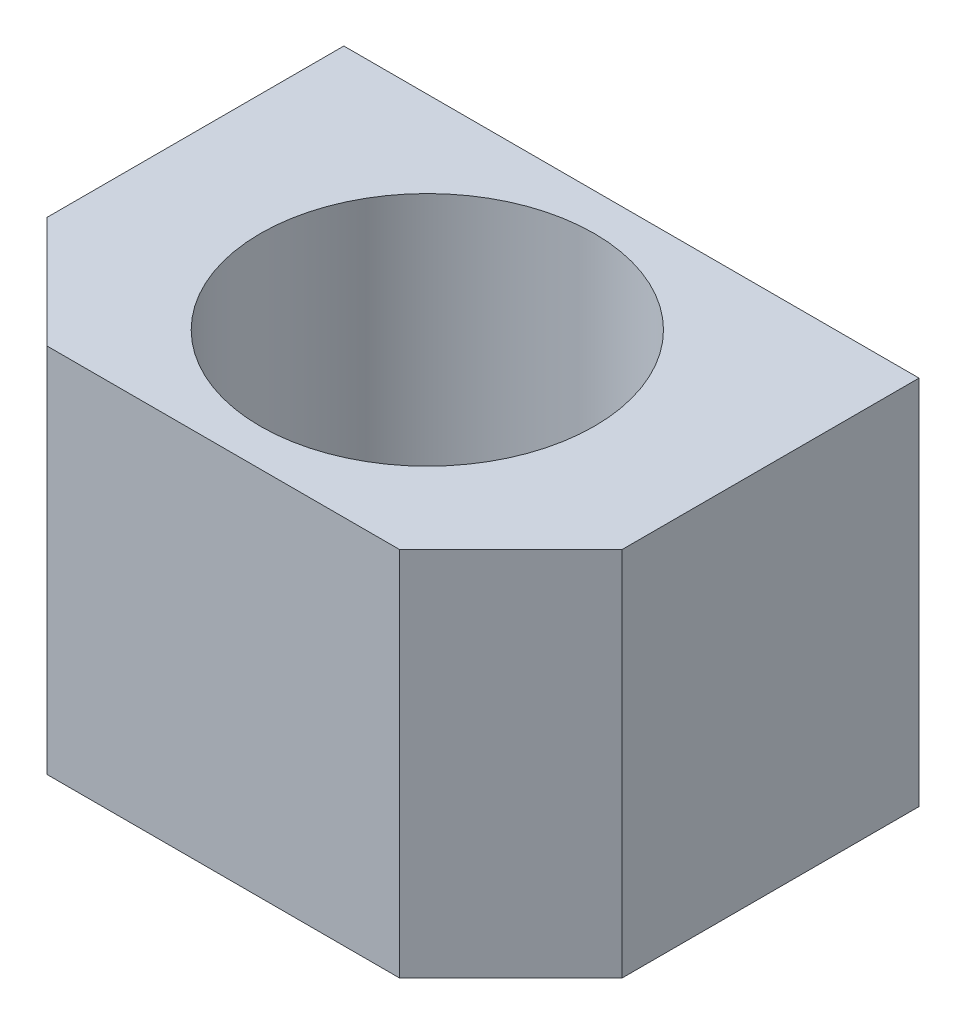
ISO-10303-21;
HEADER;
FILE_DESCRIPTION(('STEP AP214'),'2;1');
FILE_NAME('part.step','',(''),(''),'','','');
FILE_SCHEMA(('AUTOMOTIVE_DESIGN { 1 0 10303 214 1 1 1 1 }'));
ENDSEC;
DATA;
#1=APPLICATION_CONTEXT('core data for automotive mechanical design processes');
#2=APPLICATION_PROTOCOL_DEFINITION('international standard','automotive_design',2000,#1);
#3=PRODUCT_CONTEXT('',#1,'mechanical');
#4=PRODUCT('Part','Part','',(#3));
#5=PRODUCT_RELATED_PRODUCT_CATEGORY('part','',(#4));
#6=PRODUCT_DEFINITION_FORMATION('','',#4);
#7=PRODUCT_DEFINITION_CONTEXT('part definition',#1,'design');
#8=PRODUCT_DEFINITION('design','',#6,#7);
#9=PRODUCT_DEFINITION_SHAPE('','',#8);
#10=(LENGTH_UNIT() NAMED_UNIT(*) SI_UNIT(.MILLI.,.METRE.));
#11=(NAMED_UNIT(*) PLANE_ANGLE_UNIT() SI_UNIT($,.RADIAN.));
#12=(NAMED_UNIT(*) SI_UNIT($,.STERADIAN.) SOLID_ANGLE_UNIT());
#13=UNCERTAINTY_MEASURE_WITH_UNIT(LENGTH_MEASURE(1.E-05),#10,'distance_accuracy_value','');
#14=(GEOMETRIC_REPRESENTATION_CONTEXT(3) GLOBAL_UNCERTAINTY_ASSIGNED_CONTEXT((#13)) GLOBAL_UNIT_ASSIGNED_CONTEXT((#10,
#11,#12)) REPRESENTATION_CONTEXT('',''));
#15=CARTESIAN_POINT('',(0.,0.,0.));
#16=DIRECTION('',(0.,0.,1.));
#17=DIRECTION('',(1.,0.,0.));
#18=AXIS2_PLACEMENT_3D('',#15,#16,#17);
#19=CARTESIAN_POINT('',(0.,-20.,22.));
#20=DIRECTION('',(0.,1.,0.));
#21=DIRECTION('',(0.,0.,-1.));
#22=AXIS2_PLACEMENT_3D('',#19,#20,#21);
#23=PLANE('',#22);
#24=CARTESIAN_POINT('',(0.,-20.,22.));
#25=DIRECTION('',(0.,-1.,0.));
#26=DIRECTION('',(1.,0.,0.));
#27=AXIS2_PLACEMENT_3D('',#24,#25,#26);
#28=CIRCLE('',#27,18.);
#29=CARTESIAN_POINT('',(-18.,-20.,22.));
#30=VERTEX_POINT('',#29);
#31=EDGE_CURVE('E232',#30,#30,#28,.T.);
#32=ORIENTED_EDGE('',*,*,#31,.F.);
#33=EDGE_LOOP('',(#32));
#34=FACE_BOUND('',#33,.T.);
#35=CARTESIAN_POINT('',(-16.6170093578839,-20.,5.38299064211615));
#36=DIRECTION('',(0.,1.,0.));
#37=DIRECTION('',(0.,0.,-1.));
#38=AXIS2_PLACEMENT_3D('',#35,#36,#37);
#39=CIRCLE('',#38,2.5175);
#40=CARTESIAN_POINT('',(-16.6170093578839,-20.,7.90049064211614));
#41=VERTEX_POINT('',#40);
#42=EDGE_CURVE('E218',#41,#41,#39,.T.);
#43=ORIENTED_EDGE('',*,*,#42,.T.);
#44=EDGE_LOOP('',(#43));
#45=FACE_BOUND('',#44,.T.);
#46=CARTESIAN_POINT('',(-16.6170093578839,-20.,38.6170093578839));
#47=DIRECTION('',(0.,1.,0.));
#48=DIRECTION('',(0.,0.,-1.));
#49=AXIS2_PLACEMENT_3D('',#46,#47,#48);
#50=CIRCLE('',#49,2.5175);
#51=CARTESIAN_POINT('',(-16.6170093578839,-20.,41.1345093578839));
#52=VERTEX_POINT('',#51);
#53=EDGE_CURVE('E200',#52,#52,#50,.T.);
#54=ORIENTED_EDGE('',*,*,#53,.T.);
#55=EDGE_LOOP('',(#54));
#56=FACE_BOUND('',#55,.T.);
#57=CARTESIAN_POINT('',(-23.5,-20.,22.));
#58=DIRECTION('',(0.,1.,0.));
#59=DIRECTION('',(0.,0.,-1.));
#60=AXIS2_PLACEMENT_3D('',#57,#58,#59);
#61=CIRCLE('',#60,2.5175);
#62=CARTESIAN_POINT('',(-23.5,-20.,24.5175));
#63=VERTEX_POINT('',#62);
#64=EDGE_CURVE('E389',#63,#63,#61,.T.);
#65=ORIENTED_EDGE('',*,*,#64,.T.);
#66=EDGE_LOOP('',(#65));
#67=FACE_BOUND('',#66,.T.);
#68=CARTESIAN_POINT('',(16.6170093578839,-20.,5.38299064211615));
#69=DIRECTION('',(0.,1.,0.));
#70=DIRECTION('',(0.,0.,-1.));
#71=AXIS2_PLACEMENT_3D('',#68,#69,#70);
#72=CIRCLE('',#71,2.5175);
#73=CARTESIAN_POINT('',(16.6170093578839,-20.,7.90049064211614));
#74=VERTEX_POINT('',#73);
#75=EDGE_CURVE('E348',#74,#74,#72,.T.);
#76=ORIENTED_EDGE('',*,*,#75,.T.);
#77=EDGE_LOOP('',(#76));
#78=FACE_BOUND('',#77,.T.);
#79=CARTESIAN_POINT('',(16.6170093578839,-20.,38.6170093578839));
#80=DIRECTION('',(0.,1.,0.));
#81=DIRECTION('',(0.,0.,-1.));
#82=AXIS2_PLACEMENT_3D('',#79,#80,#81);
#83=CIRCLE('',#82,2.5175);
#84=CARTESIAN_POINT('',(16.6170093578839,-20.,41.1345093578839));
#85=VERTEX_POINT('',#84);
#86=EDGE_CURVE('E375',#85,#85,#83,.T.);
#87=ORIENTED_EDGE('',*,*,#86,.T.);
#88=EDGE_LOOP('',(#87));
#89=FACE_BOUND('',#88,.T.);
#90=CARTESIAN_POINT('',(23.5,-20.,22.));
#91=DIRECTION('',(0.,1.,0.));
#92=DIRECTION('',(0.,0.,-1.));
#93=AXIS2_PLACEMENT_3D('',#90,#91,#92);
#94=CIRCLE('',#93,2.5175);
#95=CARTESIAN_POINT('',(23.5,-20.,24.5175));
#96=VERTEX_POINT('',#95);
#97=EDGE_CURVE('E318',#96,#96,#94,.T.);
#98=ORIENTED_EDGE('',*,*,#97,.T.);
#99=EDGE_LOOP('',(#98));
#100=FACE_BOUND('',#99,.T.);
#101=DIRECTION('',(0.707106781186547,0.,-0.707106781186548));
#102=VECTOR('',#101,1.);
#103=CARTESIAN_POINT('',(19.,-20.,44.));
#104=LINE('',#103,#102);
#105=CARTESIAN_POINT('',(19.,-20.,44.));
#106=VERTEX_POINT('',#105);
#107=CARTESIAN_POINT('',(31.,-20.,32.));
#108=VERTEX_POINT('',#107);
#109=EDGE_CURVE('E25',#106,#108,#104,.T.);
#110=ORIENTED_EDGE('',*,*,#109,.F.);
#111=DIRECTION('',(1.,0.,0.));
#112=VECTOR('',#111,1.);
#113=CARTESIAN_POINT('',(-31.,-20.,44.));
#114=LINE('',#113,#112);
#115=CARTESIAN_POINT('',(-19.,-20.,44.));
#116=VERTEX_POINT('',#115);
#117=EDGE_CURVE('E236',#116,#106,#114,.T.);
#118=ORIENTED_EDGE('',*,*,#117,.F.);
#119=DIRECTION('',(0.707106781186547,0.,0.707106781186548));
#120=VECTOR('',#119,1.);
#121=CARTESIAN_POINT('',(-31.,-20.,32.));
#122=LINE('',#121,#120);
#123=CARTESIAN_POINT('',(-31.,-20.,32.));
#124=VERTEX_POINT('',#123);
#125=EDGE_CURVE('E250',#124,#116,#122,.T.);
#126=ORIENTED_EDGE('',*,*,#125,.F.);
#127=DIRECTION('',(0.,0.,1.));
#128=VECTOR('',#127,1.);
#129=CARTESIAN_POINT('',(-31.,-20.,0.));
#130=LINE('',#129,#128);
#131=CARTESIAN_POINT('',(-31.,-20.,0.));
#132=VERTEX_POINT('',#131);
#133=EDGE_CURVE('E260',#132,#124,#130,.T.);
#134=ORIENTED_EDGE('',*,*,#133,.F.);
#135=DIRECTION('',(-1.,0.,0.));
#136=VECTOR('',#135,1.);
#137=CARTESIAN_POINT('',(31.,-20.,0.));
#138=LINE('',#137,#136);
#139=CARTESIAN_POINT('',(31.,-20.,0.));
#140=VERTEX_POINT('',#139);
#141=EDGE_CURVE('E270',#140,#132,#138,.T.);
#142=ORIENTED_EDGE('',*,*,#141,.F.);
#143=DIRECTION('',(0.,0.,-1.));
#144=VECTOR('',#143,1.);
#145=CARTESIAN_POINT('',(31.,-20.,44.));
#146=LINE('',#145,#144);
#147=EDGE_CURVE('E280',#108,#140,#146,.T.);
#148=ORIENTED_EDGE('',*,*,#147,.F.);
#149=EDGE_LOOP('',(#110,#118,#126,#134,#142,#148));
#150=FACE_BOUND('',#149,.T.);
#151=ADVANCED_FACE('F17',(#34,#45,#56,#67,#78,#89,#100,#150),#23,.F.);
#152=CARTESIAN_POINT('',(0.,20.,22.));
#153=DIRECTION('',(0.,1.,0.));
#154=DIRECTION('',(0.,0.,-1.));
#155=AXIS2_PLACEMENT_3D('',#152,#153,#154);
#156=PLANE('',#155);
#157=CARTESIAN_POINT('',(0.,20.,22.));
#158=DIRECTION('',(0.,-1.,0.));
#159=DIRECTION('',(1.,0.,0.));
#160=AXIS2_PLACEMENT_3D('',#157,#158,#159);
#161=CIRCLE('',#160,18.);
#162=CARTESIAN_POINT('',(-18.,20.,22.));
#163=VERTEX_POINT('',#162);
#164=EDGE_CURVE('E226',#163,#163,#161,.T.);
#165=ORIENTED_EDGE('',*,*,#164,.T.);
#166=EDGE_LOOP('',(#165));
#167=FACE_BOUND('',#166,.T.);
#168=DIRECTION('',(0.707106781186547,0.,-0.707106781186548));
#169=VECTOR('',#168,1.);
#170=CARTESIAN_POINT('',(19.,20.,44.));
#171=LINE('',#170,#169);
#172=CARTESIAN_POINT('',(19.,20.,44.));
#173=VERTEX_POINT('',#172);
#174=CARTESIAN_POINT('',(31.,20.,32.));
#175=VERTEX_POINT('',#174);
#176=EDGE_CURVE('E11',#173,#175,#171,.T.);
#177=ORIENTED_EDGE('',*,*,#176,.T.);
#178=DIRECTION('',(0.,0.,-1.));
#179=VECTOR('',#178,1.);
#180=CARTESIAN_POINT('',(31.,20.,44.));
#181=LINE('',#180,#179);
#182=CARTESIAN_POINT('',(31.,20.,0.));
#183=VERTEX_POINT('',#182);
#184=EDGE_CURVE('E278',#175,#183,#181,.T.);
#185=ORIENTED_EDGE('',*,*,#184,.T.);
#186=DIRECTION('',(-1.,0.,0.));
#187=VECTOR('',#186,1.);
#188=CARTESIAN_POINT('',(31.,20.,0.));
#189=LINE('',#188,#187);
#190=CARTESIAN_POINT('',(-31.,20.,0.));
#191=VERTEX_POINT('',#190);
#192=EDGE_CURVE('E269',#183,#191,#189,.T.);
#193=ORIENTED_EDGE('',*,*,#192,.T.);
#194=DIRECTION('',(0.,0.,1.));
#195=VECTOR('',#194,1.);
#196=CARTESIAN_POINT('',(-31.,20.,0.));
#197=LINE('',#196,#195);
#198=CARTESIAN_POINT('',(-31.,20.,32.));
#199=VERTEX_POINT('',#198);
#200=EDGE_CURVE('E257',#191,#199,#197,.T.);
#201=ORIENTED_EDGE('',*,*,#200,.T.);
#202=DIRECTION('',(0.707106781186547,0.,0.707106781186548));
#203=VECTOR('',#202,1.);
#204=CARTESIAN_POINT('',(-31.,20.,32.));
#205=LINE('',#204,#203);
#206=CARTESIAN_POINT('',(-19.,20.,44.));
#207=VERTEX_POINT('',#206);
#208=EDGE_CURVE('E249',#199,#207,#205,.T.);
#209=ORIENTED_EDGE('',*,*,#208,.T.);
#210=DIRECTION('',(1.,0.,0.));
#211=VECTOR('',#210,1.);
#212=CARTESIAN_POINT('',(-31.,20.,44.));
#213=LINE('',#212,#211);
#214=EDGE_CURVE('E238',#207,#173,#213,.T.);
#215=ORIENTED_EDGE('',*,*,#214,.T.);
#216=EDGE_LOOP('',(#177,#185,#193,#201,#209,#215));
#217=FACE_BOUND('',#216,.T.);
#218=ADVANCED_FACE('F315',(#167,#217),#156,.T.);
#219=CARTESIAN_POINT('',(19.,-20.,44.));
#220=DIRECTION('',(0.707106781186548,0.,0.707106781186547));
#221=DIRECTION('',(0.,-1.,0.));
#222=AXIS2_PLACEMENT_3D('',#219,#220,#221);
#223=PLANE('',#222);
#224=ORIENTED_EDGE('',*,*,#109,.T.);
#225=DIRECTION('',(0.,1.,0.));
#226=VECTOR('',#225,1.);
#227=CARTESIAN_POINT('',(31.,-20.,32.));
#228=LINE('',#227,#226);
#229=EDGE_CURVE('E281',#108,#175,#228,.T.);
#230=ORIENTED_EDGE('',*,*,#229,.T.);
#231=ORIENTED_EDGE('',*,*,#176,.F.);
#232=DIRECTION('',(0.,1.,0.));
#233=VECTOR('',#232,1.);
#234=CARTESIAN_POINT('',(19.,-20.,44.));
#235=LINE('',#234,#233);
#236=EDGE_CURVE('E242',#106,#173,#235,.T.);
#237=ORIENTED_EDGE('',*,*,#236,.F.);
#238=EDGE_LOOP('',(#224,#230,#231,#237));
#239=FACE_BOUND('',#238,.T.);
#240=ADVANCED_FACE('F287',(#239),#223,.T.);
#241=CARTESIAN_POINT('',(31.,-20.,32.));
#242=DIRECTION('',(1.,0.,0.));
#243=DIRECTION('',(0.,0.,1.));
#244=AXIS2_PLACEMENT_3D('',#241,#242,#243);
#245=PLANE('',#244);
#246=ORIENTED_EDGE('',*,*,#147,.T.);
#247=DIRECTION('',(0.,1.,0.));
#248=VECTOR('',#247,1.);
#249=CARTESIAN_POINT('',(31.,-20.,0.));
#250=LINE('',#249,#248);
#251=EDGE_CURVE('E272',#140,#183,#250,.T.);
#252=ORIENTED_EDGE('',*,*,#251,.T.);
#253=ORIENTED_EDGE('',*,*,#184,.F.);
#254=ORIENTED_EDGE('',*,*,#229,.F.);
#255=EDGE_LOOP('',(#246,#252,#253,#254));
#256=FACE_BOUND('',#255,.T.);
#257=ADVANCED_FACE('F300',(#256),#245,.T.);
#258=CARTESIAN_POINT('',(31.,-20.,0.));
#259=DIRECTION('',(0.,0.,-1.));
#260=DIRECTION('',(0.,-1.,0.));
#261=AXIS2_PLACEMENT_3D('',#258,#259,#260);
#262=PLANE('',#261);
#263=CARTESIAN_POINT('',(24.,-12.,0.));
#264=DIRECTION('',(0.,0.,1.));
#265=DIRECTION('',(-1.,0.,0.));
#266=AXIS2_PLACEMENT_3D('',#263,#264,#265);
#267=CIRCLE('',#266,2.5175);
#268=CARTESIAN_POINT('',(26.5175,-12.,0.));
#269=VERTEX_POINT('',#268);
#270=EDGE_CURVE('E338',#269,#269,#267,.T.);
#271=ORIENTED_EDGE('',*,*,#270,.T.);
#272=EDGE_LOOP('',(#271));
#273=FACE_BOUND('',#272,.T.);
#274=CARTESIAN_POINT('',(-24.,12.,0.));
#275=DIRECTION('',(0.,0.,1.));
#276=DIRECTION('',(-1.,0.,0.));
#277=AXIS2_PLACEMENT_3D('',#274,#275,#276);
#278=CIRCLE('',#277,2.5175);
#279=CARTESIAN_POINT('',(-21.4825,12.,0.));
#280=VERTEX_POINT('',#279);
#281=EDGE_CURVE('E343',#280,#280,#278,.T.);
#282=ORIENTED_EDGE('',*,*,#281,.T.);
#283=EDGE_LOOP('',(#282));
#284=FACE_BOUND('',#283,.T.);
#285=CARTESIAN_POINT('',(-24.,-12.,0.));
#286=DIRECTION('',(0.,0.,1.));
#287=DIRECTION('',(-1.,0.,0.));
#288=AXIS2_PLACEMENT_3D('',#285,#286,#287);
#289=CIRCLE('',#288,2.5175);
#290=CARTESIAN_POINT('',(-21.4825,-12.,0.));
#291=VERTEX_POINT('',#290);
#292=EDGE_CURVE('E322',#291,#291,#289,.T.);
#293=ORIENTED_EDGE('',*,*,#292,.T.);
#294=EDGE_LOOP('',(#293));
#295=FACE_BOUND('',#294,.T.);
#296=CARTESIAN_POINT('',(24.,12.,0.));
#297=DIRECTION('',(0.,0.,1.));
#298=DIRECTION('',(-1.,0.,0.));
#299=AXIS2_PLACEMENT_3D('',#296,#297,#298);
#300=CIRCLE('',#299,2.5175);
#301=CARTESIAN_POINT('',(26.5175,12.,0.));
#302=VERTEX_POINT('',#301);
#303=EDGE_CURVE('E451',#302,#302,#300,.T.);
#304=ORIENTED_EDGE('',*,*,#303,.T.);
#305=EDGE_LOOP('',(#304));
#306=FACE_BOUND('',#305,.T.);
#307=ORIENTED_EDGE('',*,*,#141,.T.);
#308=DIRECTION('',(0.,1.,0.));
#309=VECTOR('',#308,1.);
#310=CARTESIAN_POINT('',(-31.,-20.,0.));
#311=LINE('',#310,#309);
#312=EDGE_CURVE('E263',#132,#191,#311,.T.);
#313=ORIENTED_EDGE('',*,*,#312,.T.);
#314=ORIENTED_EDGE('',*,*,#192,.F.);
#315=ORIENTED_EDGE('',*,*,#251,.F.);
#316=EDGE_LOOP('',(#307,#313,#314,#315));
#317=FACE_BOUND('',#316,.T.);
#318=ADVANCED_FACE('F302',(#273,#284,#295,#306,#317),#262,.T.);
#319=CARTESIAN_POINT('',(-31.,-20.,0.));
#320=DIRECTION('',(-1.,0.,0.));
#321=DIRECTION('',(0.,0.,1.));
#322=AXIS2_PLACEMENT_3D('',#319,#320,#321);
#323=PLANE('',#322);
#324=ORIENTED_EDGE('',*,*,#133,.T.);
#325=DIRECTION('',(0.,1.,0.));
#326=VECTOR('',#325,1.);
#327=CARTESIAN_POINT('',(-31.,-20.,32.));
#328=LINE('',#327,#326);
#329=EDGE_CURVE('E251',#124,#199,#328,.T.);
#330=ORIENTED_EDGE('',*,*,#329,.T.);
#331=ORIENTED_EDGE('',*,*,#200,.F.);
#332=ORIENTED_EDGE('',*,*,#312,.F.);
#333=EDGE_LOOP('',(#324,#330,#331,#332));
#334=FACE_BOUND('',#333,.T.);
#335=ADVANCED_FACE('F306',(#334),#323,.T.);
#336=CARTESIAN_POINT('',(-31.,-20.,32.));
#337=DIRECTION('',(-0.707106781186548,0.,0.707106781186547));
#338=DIRECTION('',(0.,1.,0.));
#339=AXIS2_PLACEMENT_3D('',#336,#337,#338);
#340=PLANE('',#339);
#341=ORIENTED_EDGE('',*,*,#125,.T.);
#342=DIRECTION('',(0.,1.,0.));
#343=VECTOR('',#342,1.);
#344=CARTESIAN_POINT('',(-19.,-20.,44.));
#345=LINE('',#344,#343);
#346=EDGE_CURVE('E245',#116,#207,#345,.T.);
#347=ORIENTED_EDGE('',*,*,#346,.T.);
#348=ORIENTED_EDGE('',*,*,#208,.F.);
#349=ORIENTED_EDGE('',*,*,#329,.F.);
#350=EDGE_LOOP('',(#341,#347,#348,#349));
#351=FACE_BOUND('',#350,.T.);
#352=ADVANCED_FACE('F697',(#351),#340,.T.);
#353=CARTESIAN_POINT('',(-19.,-20.,44.));
#354=DIRECTION('',(0.,0.,1.));
#355=DIRECTION('',(0.,-1.,0.));
#356=AXIS2_PLACEMENT_3D('',#353,#354,#355);
#357=PLANE('',#356);
#358=ORIENTED_EDGE('',*,*,#117,.T.);
#359=ORIENTED_EDGE('',*,*,#236,.T.);
#360=ORIENTED_EDGE('',*,*,#214,.F.);
#361=ORIENTED_EDGE('',*,*,#346,.F.);
#362=EDGE_LOOP('',(#358,#359,#360,#361));
#363=FACE_BOUND('',#362,.T.);
#364=ADVANCED_FACE('F632',(#363),#357,.T.);
#365=CARTESIAN_POINT('',(0.,-20.,22.));
#366=DIRECTION('',(0.,1.,0.));
#367=DIRECTION('',(1.,0.,0.));
#368=AXIS2_PLACEMENT_3D('',#365,#366,#367);
#369=CYLINDRICAL_SURFACE('',#368,18.);
#370=ORIENTED_EDGE('',*,*,#164,.F.);
#371=DIRECTION('',(0.,-1.,0.));
#372=VECTOR('',#371,1.);
#373=CARTESIAN_POINT('',(-18.,-20.,22.));
#374=LINE('',#373,#372);
#375=EDGE_CURVE('E230',#163,#30,#374,.T.);
#376=ORIENTED_EDGE('',*,*,#375,.T.);
#377=ORIENTED_EDGE('',*,*,#31,.T.);
#378=ORIENTED_EDGE('',*,*,#375,.F.);
#379=EDGE_LOOP('',(#370,#376,#377,#378));
#380=FACE_BOUND('',#379,.T.);
#381=ADVANCED_FACE('F627',(#380),#369,.F.);
#382=CARTESIAN_POINT('',(-16.6170093578839,-10.,5.38299064211614));
#383=DIRECTION('',(0.,1.,0.));
#384=DIRECTION('',(0.,0.,-1.));
#385=AXIS2_PLACEMENT_3D('',#382,#383,#384);
#386=CYLINDRICAL_SURFACE('',#385,2.5175);
#387=ORIENTED_EDGE('',*,*,#42,.F.);
#388=DIRECTION('',(0.,1.,0.));
#389=VECTOR('',#388,1.);
#390=CARTESIAN_POINT('',(-16.6170093578839,-10.,7.90049064211614));
#391=LINE('',#390,#389);
#392=CARTESIAN_POINT('',(-16.6170093578839,0.,7.90049064211614));
#393=VERTEX_POINT('',#392);
#394=EDGE_CURVE('E224',#41,#393,#391,.T.);
#395=ORIENTED_EDGE('',*,*,#394,.T.);
#396=CARTESIAN_POINT('',(-16.6170093578839,0.,5.38299064211614));
#397=DIRECTION('',(0.,1.,0.));
#398=DIRECTION('',(0.,0.,-1.));
#399=AXIS2_PLACEMENT_3D('',#396,#397,#398);
#400=CIRCLE('',#399,2.5175);
#401=EDGE_CURVE('E201',#393,#393,#400,.T.);
#402=ORIENTED_EDGE('',*,*,#401,.T.);
#403=ORIENTED_EDGE('',*,*,#394,.F.);
#404=EDGE_LOOP('',(#387,#395,#402,#403));
#405=FACE_BOUND('',#404,.T.);
#406=ADVANCED_FACE('F633',(#405),#386,.F.);
#407=CARTESIAN_POINT('',(-16.6170093578839,0.756333304200942,5.38299064211614));
#408=DIRECTION('',(0.,-1.,0.));
#409=DIRECTION('',(0.,0.,-1.));
#410=AXIS2_PLACEMENT_3D('',#407,#408,#409);
#411=CONICAL_SURFACE('',#410,1.25875,1.02974425867665);
#412=CARTESIAN_POINT('',(-16.6170093578839,1.51266660840189,5.38299064211614));
#413=VERTEX_POINT('',#412);
#414=VERTEX_LOOP('',#413);
#415=FACE_BOUND('',#414,.T.);
#416=ORIENTED_EDGE('',*,*,#401,.F.);
#417=EDGE_LOOP('',(#416));
#418=FACE_BOUND('',#417,.T.);
#419=ADVANCED_FACE('F807',(#415,#418),#411,.F.);
#420=CARTESIAN_POINT('',(-16.6170093578839,-10.,38.6170093578839));
#421=DIRECTION('',(0.,1.,0.));
#422=DIRECTION('',(0.,0.,-1.));
#423=AXIS2_PLACEMENT_3D('',#420,#421,#422);
#424=CYLINDRICAL_SURFACE('',#423,2.5175);
#425=ORIENTED_EDGE('',*,*,#53,.F.);
#426=DIRECTION('',(0.,1.,0.));
#427=VECTOR('',#426,1.);
#428=CARTESIAN_POINT('',(-16.6170093578839,-10.,41.1345093578839));
#429=LINE('',#428,#427);
#430=CARTESIAN_POINT('',(-16.6170093578839,0.,41.1345093578839));
#431=VERTEX_POINT('',#430);
#432=EDGE_CURVE('E198',#52,#431,#429,.T.);
#433=ORIENTED_EDGE('',*,*,#432,.T.);
#434=CARTESIAN_POINT('',(-16.6170093578839,0.,38.6170093578839));
#435=DIRECTION('',(0.,1.,0.));
#436=DIRECTION('',(0.,0.,-1.));
#437=AXIS2_PLACEMENT_3D('',#434,#435,#436);
#438=CIRCLE('',#437,2.5175);
#439=EDGE_CURVE('E203',#431,#431,#438,.T.);
#440=ORIENTED_EDGE('',*,*,#439,.T.);
#441=ORIENTED_EDGE('',*,*,#432,.F.);
#442=EDGE_LOOP('',(#425,#433,#440,#441));
#443=FACE_BOUND('',#442,.T.);
#444=ADVANCED_FACE('F196',(#443),#424,.F.);
#445=CARTESIAN_POINT('',(-16.6170093578839,0.756333304200942,38.6170093578839));
#446=DIRECTION('',(0.,-1.,0.));
#447=DIRECTION('',(0.,0.,-1.));
#448=AXIS2_PLACEMENT_3D('',#445,#446,#447);
#449=CONICAL_SURFACE('',#448,1.25875,1.02974425867665);
#450=CARTESIAN_POINT('',(-16.6170093578839,1.51266660840189,38.6170093578839));
#451=VERTEX_POINT('',#450);
#452=VERTEX_LOOP('',#451);
#453=FACE_BOUND('',#452,.T.);
#454=ORIENTED_EDGE('',*,*,#439,.F.);
#455=EDGE_LOOP('',(#454));
#456=FACE_BOUND('',#455,.T.);
#457=ADVANCED_FACE('F793',(#453,#456),#449,.F.);
#458=CARTESIAN_POINT('',(-23.5,-10.,22.));
#459=DIRECTION('',(0.,1.,0.));
#460=DIRECTION('',(0.,0.,-1.));
#461=AXIS2_PLACEMENT_3D('',#458,#459,#460);
#462=CYLINDRICAL_SURFACE('',#461,2.5175);
#463=ORIENTED_EDGE('',*,*,#64,.F.);
#464=DIRECTION('',(0.,1.,0.));
#465=VECTOR('',#464,1.);
#466=CARTESIAN_POINT('',(-23.5,-10.,24.5175));
#467=LINE('',#466,#465);
#468=CARTESIAN_POINT('',(-23.5,0.,24.5175));
#469=VERTEX_POINT('',#468);
#470=EDGE_CURVE('E215',#63,#469,#467,.T.);
#471=ORIENTED_EDGE('',*,*,#470,.T.);
#472=CARTESIAN_POINT('',(-23.5,0.,22.));
#473=DIRECTION('',(0.,1.,0.));
#474=DIRECTION('',(0.,0.,-1.));
#475=AXIS2_PLACEMENT_3D('',#472,#473,#474);
#476=CIRCLE('',#475,2.5175);
#477=EDGE_CURVE('E383',#469,#469,#476,.T.);
#478=ORIENTED_EDGE('',*,*,#477,.T.);
#479=ORIENTED_EDGE('',*,*,#470,.F.);
#480=EDGE_LOOP('',(#463,#471,#478,#479));
#481=FACE_BOUND('',#480,.T.);
#482=ADVANCED_FACE('F395',(#481),#462,.F.);
#483=CARTESIAN_POINT('',(-23.5,0.756333304200942,22.));
#484=DIRECTION('',(0.,-1.,0.));
#485=DIRECTION('',(0.,0.,-1.));
#486=AXIS2_PLACEMENT_3D('',#483,#484,#485);
#487=CONICAL_SURFACE('',#486,1.25875,1.02974425867665);
#488=CARTESIAN_POINT('',(-23.5,1.51266660840189,22.));
#489=VERTEX_POINT('',#488);
#490=VERTEX_LOOP('',#489);
#491=FACE_BOUND('',#490,.T.);
#492=ORIENTED_EDGE('',*,*,#477,.F.);
#493=EDGE_LOOP('',(#492));
#494=FACE_BOUND('',#493,.T.);
#495=ADVANCED_FACE('F777',(#491,#494),#487,.F.);
#496=CARTESIAN_POINT('',(16.6170093578839,-10.,5.38299064211614));
#497=DIRECTION('',(0.,-1.,0.));
#498=DIRECTION('',(0.,0.,-1.));
#499=AXIS2_PLACEMENT_3D('',#496,#497,#498);
#500=CYLINDRICAL_SURFACE('',#499,2.5175);
#501=ORIENTED_EDGE('',*,*,#75,.F.);
#502=DIRECTION('',(0.,1.,0.));
#503=VECTOR('',#502,1.);
#504=CARTESIAN_POINT('',(16.6170093578839,-10.,7.90049064211614));
#505=LINE('',#504,#503);
#506=CARTESIAN_POINT('',(16.6170093578839,0.,7.90049064211614));
#507=VERTEX_POINT('',#506);
#508=EDGE_CURVE('E381',#74,#507,#505,.T.);
#509=ORIENTED_EDGE('',*,*,#508,.T.);
#510=CARTESIAN_POINT('',(16.6170093578839,0.,5.38299064211614));
#511=DIRECTION('',(0.,-1.,0.));
#512=DIRECTION('',(0.,0.,-1.));
#513=AXIS2_PLACEMENT_3D('',#510,#511,#512);
#514=CIRCLE('',#513,2.5175);
#515=EDGE_CURVE('E342',#507,#507,#514,.T.);
#516=ORIENTED_EDGE('',*,*,#515,.F.);
#517=ORIENTED_EDGE('',*,*,#508,.F.);
#518=EDGE_LOOP('',(#501,#509,#516,#517));
#519=FACE_BOUND('',#518,.T.);
#520=ADVANCED_FACE('F748',(#519),#500,.F.);
#521=CARTESIAN_POINT('',(16.6170093578839,0.756333304200942,5.38299064211614));
#522=DIRECTION('',(0.,-1.,0.));
#523=DIRECTION('',(0.,0.,-1.));
#524=AXIS2_PLACEMENT_3D('',#521,#522,#523);
#525=CONICAL_SURFACE('',#524,1.25875,1.02974425867665);
#526=CARTESIAN_POINT('',(16.6170093578839,1.51266660840189,5.38299064211614));
#527=VERTEX_POINT('',#526);
#528=VERTEX_LOOP('',#527);
#529=FACE_BOUND('',#528,.T.);
#530=ORIENTED_EDGE('',*,*,#515,.T.);
#531=EDGE_LOOP('',(#530));
#532=FACE_BOUND('',#531,.T.);
#533=ADVANCED_FACE('F739',(#529,#532),#525,.F.);
#534=CARTESIAN_POINT('',(16.6170093578839,-10.,38.6170093578839));
#535=DIRECTION('',(0.,-1.,0.));
#536=DIRECTION('',(0.,0.,-1.));
#537=AXIS2_PLACEMENT_3D('',#534,#535,#536);
#538=CYLINDRICAL_SURFACE('',#537,2.5175);
#539=ORIENTED_EDGE('',*,*,#86,.F.);
#540=DIRECTION('',(0.,1.,0.));
#541=VECTOR('',#540,1.);
#542=CARTESIAN_POINT('',(16.6170093578839,-10.,41.1345093578839));
#543=LINE('',#542,#541);
#544=CARTESIAN_POINT('',(16.6170093578839,0.,41.1345093578839));
#545=VERTEX_POINT('',#544);
#546=EDGE_CURVE('E347',#85,#545,#543,.T.);
#547=ORIENTED_EDGE('',*,*,#546,.T.);
#548=CARTESIAN_POINT('',(16.6170093578839,0.,38.6170093578839));
#549=DIRECTION('',(0.,-1.,0.));
#550=DIRECTION('',(0.,0.,-1.));
#551=AXIS2_PLACEMENT_3D('',#548,#549,#550);
#552=CIRCLE('',#551,2.5175);
#553=EDGE_CURVE('E352',#545,#545,#552,.T.);
#554=ORIENTED_EDGE('',*,*,#553,.F.);
#555=ORIENTED_EDGE('',*,*,#546,.F.);
#556=EDGE_LOOP('',(#539,#547,#554,#555));
#557=FACE_BOUND('',#556,.T.);
#558=ADVANCED_FACE('F744',(#557),#538,.F.);
#559=CARTESIAN_POINT('',(16.6170093578839,0.756333304200942,38.6170093578839));
#560=DIRECTION('',(0.,-1.,0.));
#561=DIRECTION('',(0.,0.,-1.));
#562=AXIS2_PLACEMENT_3D('',#559,#560,#561);
#563=CONICAL_SURFACE('',#562,1.25875,1.02974425867665);
#564=CARTESIAN_POINT('',(16.6170093578839,1.51266660840189,38.6170093578839));
#565=VERTEX_POINT('',#564);
#566=VERTEX_LOOP('',#565);
#567=FACE_BOUND('',#566,.T.);
#568=ORIENTED_EDGE('',*,*,#553,.T.);
#569=EDGE_LOOP('',(#568));
#570=FACE_BOUND('',#569,.T.);
#571=ADVANCED_FACE('F693',(#567,#570),#563,.F.);
#572=CARTESIAN_POINT('',(23.5,-10.,22.));
#573=DIRECTION('',(0.,-1.,0.));
#574=DIRECTION('',(0.,0.,-1.));
#575=AXIS2_PLACEMENT_3D('',#572,#573,#574);
#576=CYLINDRICAL_SURFACE('',#575,2.5175);
#577=ORIENTED_EDGE('',*,*,#97,.F.);
#578=DIRECTION('',(0.,1.,0.));
#579=VECTOR('',#578,1.);
#580=CARTESIAN_POINT('',(23.5,-10.,24.5175));
#581=LINE('',#580,#579);
#582=CARTESIAN_POINT('',(23.5,0.,24.5175));
#583=VERTEX_POINT('',#582);
#584=EDGE_CURVE('E349',#96,#583,#581,.T.);
#585=ORIENTED_EDGE('',*,*,#584,.T.);
#586=CARTESIAN_POINT('',(23.5,0.,22.));
#587=DIRECTION('',(0.,-1.,0.));
#588=DIRECTION('',(0.,0.,-1.));
#589=AXIS2_PLACEMENT_3D('',#586,#587,#588);
#590=CIRCLE('',#589,2.5175);
#591=EDGE_CURVE('E339',#583,#583,#590,.T.);
#592=ORIENTED_EDGE('',*,*,#591,.F.);
#593=ORIENTED_EDGE('',*,*,#584,.F.);
#594=EDGE_LOOP('',(#577,#585,#592,#593));
#595=FACE_BOUND('',#594,.T.);
#596=ADVANCED_FACE('F684',(#595),#576,.F.);
#597=CARTESIAN_POINT('',(23.5,0.756333304200942,22.));
#598=DIRECTION('',(0.,-1.,0.));
#599=DIRECTION('',(0.,0.,-1.));
#600=AXIS2_PLACEMENT_3D('',#597,#598,#599);
#601=CONICAL_SURFACE('',#600,1.25875,1.02974425867665);
#602=CARTESIAN_POINT('',(23.5,1.51266660840189,22.));
#603=VERTEX_POINT('',#602);
#604=VERTEX_LOOP('',#603);
#605=FACE_BOUND('',#604,.T.);
#606=ORIENTED_EDGE('',*,*,#591,.T.);
#607=EDGE_LOOP('',(#606));
#608=FACE_BOUND('',#607,.T.);
#609=ADVANCED_FACE('F689',(#605,#608),#601,.F.);
#610=CARTESIAN_POINT('',(24.,-12.,7.5));
#611=DIRECTION('',(0.,0.,1.));
#612=DIRECTION('',(-1.,0.,0.));
#613=AXIS2_PLACEMENT_3D('',#610,#611,#612);
#614=CYLINDRICAL_SURFACE('',#613,2.5175);
#615=ORIENTED_EDGE('',*,*,#270,.F.);
#616=DIRECTION('',(0.,0.,1.));
#617=VECTOR('',#616,1.);
#618=CARTESIAN_POINT('',(26.5175,-12.,7.5));
#619=LINE('',#618,#617);
#620=CARTESIAN_POINT('',(26.5175,-12.,15.));
#621=VERTEX_POINT('',#620);
#622=EDGE_CURVE('E333',#269,#621,#619,.T.);
#623=ORIENTED_EDGE('',*,*,#622,.T.);
#624=CARTESIAN_POINT('',(24.,-12.,15.));
#625=DIRECTION('',(0.,0.,1.));
#626=DIRECTION('',(-1.,0.,0.));
#627=AXIS2_PLACEMENT_3D('',#624,#625,#626);
#628=CIRCLE('',#627,2.5175);
#629=EDGE_CURVE('E359',#621,#621,#628,.T.);
#630=ORIENTED_EDGE('',*,*,#629,.T.);
#631=ORIENTED_EDGE('',*,*,#622,.F.);
#632=EDGE_LOOP('',(#615,#623,#630,#631));
#633=FACE_BOUND('',#632,.T.);
#634=ADVANCED_FACE('F730',(#633),#614,.F.);
#635=CARTESIAN_POINT('',(24.,-12.,15.7563333042009));
#636=DIRECTION('',(0.,0.,-1.));
#637=DIRECTION('',(-1.,0.,0.));
#638=AXIS2_PLACEMENT_3D('',#635,#636,#637);
#639=CONICAL_SURFACE('',#638,1.25875,1.02974425867665);
#640=CARTESIAN_POINT('',(24.,-12.,16.5126666084018));
#641=VERTEX_POINT('',#640);
#642=VERTEX_LOOP('',#641);
#643=FACE_BOUND('',#642,.T.);
#644=ORIENTED_EDGE('',*,*,#629,.F.);
#645=EDGE_LOOP('',(#644));
#646=FACE_BOUND('',#645,.T.);
#647=ADVANCED_FACE('F707',(#643,#646),#639,.F.);
#648=CARTESIAN_POINT('',(-24.,12.,7.5));
#649=DIRECTION('',(0.,0.,1.));
#650=DIRECTION('',(-1.,0.,0.));
#651=AXIS2_PLACEMENT_3D('',#648,#649,#650);
#652=CYLINDRICAL_SURFACE('',#651,2.5175);
#653=ORIENTED_EDGE('',*,*,#281,.F.);
#654=DIRECTION('',(0.,0.,1.));
#655=VECTOR('',#654,1.);
#656=CARTESIAN_POINT('',(-21.4825,12.,7.5));
#657=LINE('',#656,#655);
#658=CARTESIAN_POINT('',(-21.4825,12.,15.));
#659=VERTEX_POINT('',#658);
#660=EDGE_CURVE('E360',#280,#659,#657,.T.);
#661=ORIENTED_EDGE('',*,*,#660,.T.);
#662=CARTESIAN_POINT('',(-24.,12.,15.));
#663=DIRECTION('',(0.,0.,1.));
#664=DIRECTION('',(-1.,0.,0.));
#665=AXIS2_PLACEMENT_3D('',#662,#663,#664);
#666=CIRCLE('',#665,2.5175);
#667=EDGE_CURVE('E331',#659,#659,#666,.T.);
#668=ORIENTED_EDGE('',*,*,#667,.T.);
#669=ORIENTED_EDGE('',*,*,#660,.F.);
#670=EDGE_LOOP('',(#653,#661,#668,#669));
#671=FACE_BOUND('',#670,.T.);
#672=ADVANCED_FACE('F677',(#671),#652,.F.);
#673=CARTESIAN_POINT('',(-24.,12.,15.7563333042009));
#674=DIRECTION('',(0.,0.,-1.));
#675=DIRECTION('',(-1.,0.,0.));
#676=AXIS2_PLACEMENT_3D('',#673,#674,#675);
#677=CONICAL_SURFACE('',#676,1.25875,1.02974425867665);
#678=CARTESIAN_POINT('',(-24.,12.,16.5126666084018));
#679=VERTEX_POINT('',#678);
#680=VERTEX_LOOP('',#679);
#681=FACE_BOUND('',#680,.T.);
#682=ORIENTED_EDGE('',*,*,#667,.F.);
#683=EDGE_LOOP('',(#682));
#684=FACE_BOUND('',#683,.T.);
#685=ADVANCED_FACE('F661',(#681,#684),#677,.F.);
#686=CARTESIAN_POINT('',(-24.,-12.,7.5));
#687=DIRECTION('',(0.,0.,1.));
#688=DIRECTION('',(-1.,0.,0.));
#689=AXIS2_PLACEMENT_3D('',#686,#687,#688);
#690=CYLINDRICAL_SURFACE('',#689,2.5175);
#691=ORIENTED_EDGE('',*,*,#292,.F.);
#692=DIRECTION('',(0.,0.,1.));
#693=VECTOR('',#692,1.);
#694=CARTESIAN_POINT('',(-21.4825,-12.,7.5));
#695=LINE('',#694,#693);
#696=CARTESIAN_POINT('',(-21.4825,-12.,15.));
#697=VERTEX_POINT('',#696);
#698=EDGE_CURVE('E328',#291,#697,#695,.T.);
#699=ORIENTED_EDGE('',*,*,#698,.T.);
#700=CARTESIAN_POINT('',(-24.,-12.,15.));
#701=DIRECTION('',(0.,0.,1.));
#702=DIRECTION('',(-1.,0.,0.));
#703=AXIS2_PLACEMENT_3D('',#700,#701,#702);
#704=CIRCLE('',#703,2.5175);
#705=EDGE_CURVE('E319',#697,#697,#704,.T.);
#706=ORIENTED_EDGE('',*,*,#705,.T.);
#707=ORIENTED_EDGE('',*,*,#698,.F.);
#708=EDGE_LOOP('',(#691,#699,#706,#707));
#709=FACE_BOUND('',#708,.T.);
#710=ADVANCED_FACE('F658',(#709),#690,.F.);
#711=CARTESIAN_POINT('',(-24.,-12.,15.7563333042009));
#712=DIRECTION('',(0.,0.,-1.));
#713=DIRECTION('',(-1.,0.,0.));
#714=AXIS2_PLACEMENT_3D('',#711,#712,#713);
#715=CONICAL_SURFACE('',#714,1.25875,1.02974425867665);
#716=CARTESIAN_POINT('',(-24.,-12.,16.5126666084018));
#717=VERTEX_POINT('',#716);
#718=VERTEX_LOOP('',#717);
#719=FACE_BOUND('',#718,.T.);
#720=ORIENTED_EDGE('',*,*,#705,.F.);
#721=EDGE_LOOP('',(#720));
#722=FACE_BOUND('',#721,.T.);
#723=ADVANCED_FACE('F650',(#719,#722),#715,.F.);
#724=CARTESIAN_POINT('',(24.,12.,7.5));
#725=DIRECTION('',(0.,0.,1.));
#726=DIRECTION('',(-1.,0.,0.));
#727=AXIS2_PLACEMENT_3D('',#724,#725,#726);
#728=CYLINDRICAL_SURFACE('',#727,2.5175);
#729=ORIENTED_EDGE('',*,*,#303,.F.);
#730=DIRECTION('',(0.,0.,1.));
#731=VECTOR('',#730,1.);
#732=CARTESIAN_POINT('',(26.5175,12.,7.5));
#733=LINE('',#732,#731);
#734=CARTESIAN_POINT('',(26.5175,12.,15.));
#735=VERTEX_POINT('',#734);
#736=EDGE_CURVE('E324',#302,#735,#733,.T.);
#737=ORIENTED_EDGE('',*,*,#736,.T.);
#738=CARTESIAN_POINT('',(24.,12.,15.));
#739=DIRECTION('',(0.,0.,1.));
#740=DIRECTION('',(-1.,0.,0.));
#741=AXIS2_PLACEMENT_3D('',#738,#739,#740);
#742=CIRCLE('',#741,2.5175);
#743=EDGE_CURVE('E456',#735,#735,#742,.T.);
#744=ORIENTED_EDGE('',*,*,#743,.T.);
#745=ORIENTED_EDGE('',*,*,#736,.F.);
#746=EDGE_LOOP('',(#729,#737,#744,#745));
#747=FACE_BOUND('',#746,.T.);
#748=ADVANCED_FACE('F643',(#747),#728,.F.);
#749=CARTESIAN_POINT('',(24.,12.,15.7563333042009));
#750=DIRECTION('',(0.,0.,-1.));
#751=DIRECTION('',(-1.,0.,0.));
#752=AXIS2_PLACEMENT_3D('',#749,#750,#751);
#753=CONICAL_SURFACE('',#752,1.25875,1.02974425867665);
#754=CARTESIAN_POINT('',(24.,12.,16.5126666084018));
#755=VERTEX_POINT('',#754);
#756=VERTEX_LOOP('',#755);
#757=FACE_BOUND('',#756,.T.);
#758=ORIENTED_EDGE('',*,*,#743,.F.);
#759=EDGE_LOOP('',(#758));
#760=FACE_BOUND('',#759,.T.);
#761=ADVANCED_FACE('F646',(#757,#760),#753,.F.);
#762=CLOSED_SHELL('',(#151,#218,#240,#257,#318,#335,#352,#364,#381,#406,#419,#444,#457,#482,
#495,#520,#533,#558,#571,#596,#609,#634,#647,#672,#685,#710,#723,#748,#761));
#763=MANIFOLD_SOLID_BREP('B1',#762);
#764=ADVANCED_BREP_SHAPE_REPRESENTATION('',(#18,#763),#14);
#765=SHAPE_DEFINITION_REPRESENTATION(#9,#764);
ENDSEC;
END-ISO-10303-21;
